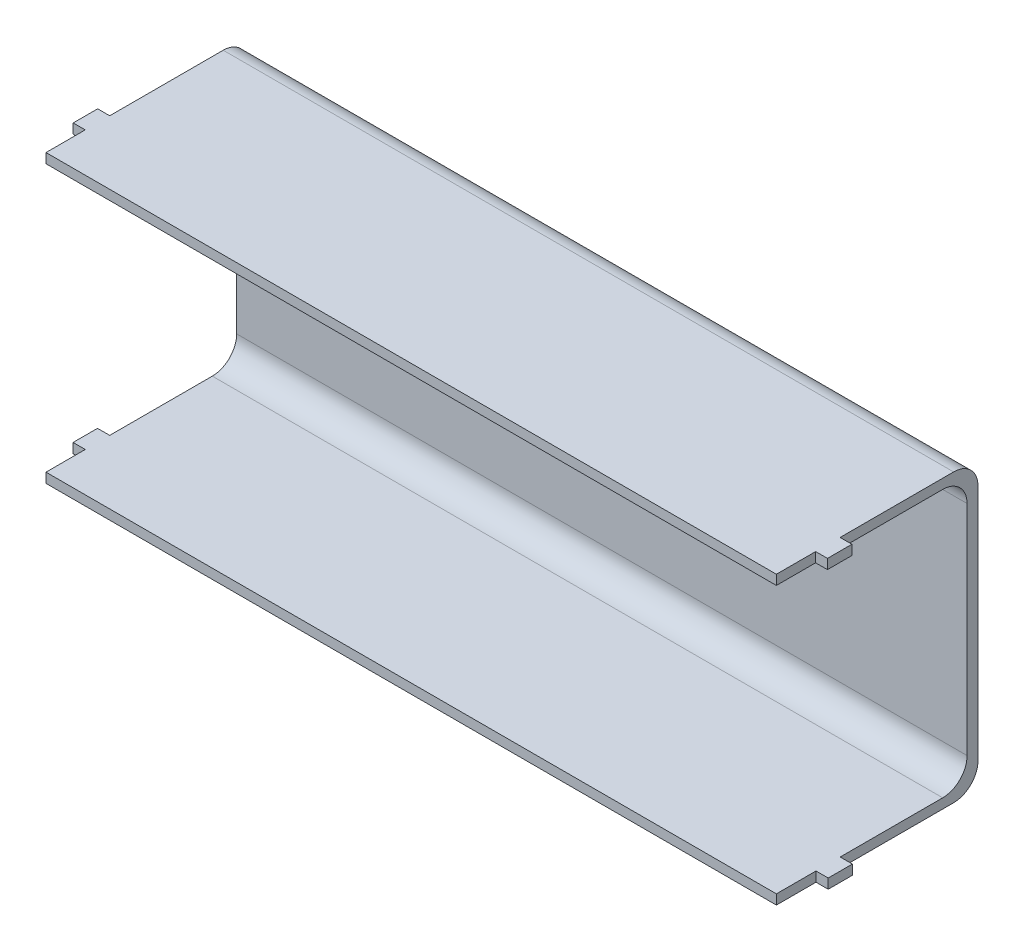
ISO-10303-21;
HEADER;
FILE_DESCRIPTION(('STEP AP214'),'2;1');
FILE_NAME('part.step','',(''),(''),'','','');
FILE_SCHEMA(('AUTOMOTIVE_DESIGN { 1 0 10303 214 1 1 1 1 }'));
ENDSEC;
DATA;
#1=APPLICATION_CONTEXT('core data for automotive mechanical design processes');
#2=APPLICATION_PROTOCOL_DEFINITION('international standard','automotive_design',2000,#1);
#3=PRODUCT_CONTEXT('',#1,'mechanical');
#4=PRODUCT('Part','Part','',(#3));
#5=PRODUCT_RELATED_PRODUCT_CATEGORY('part','',(#4));
#6=PRODUCT_DEFINITION_FORMATION('','',#4);
#7=PRODUCT_DEFINITION_CONTEXT('part definition',#1,'design');
#8=PRODUCT_DEFINITION('design','',#6,#7);
#9=PRODUCT_DEFINITION_SHAPE('','',#8);
#10=(LENGTH_UNIT() NAMED_UNIT(*) SI_UNIT(.MILLI.,.METRE.));
#11=(NAMED_UNIT(*) PLANE_ANGLE_UNIT() SI_UNIT($,.RADIAN.));
#12=(NAMED_UNIT(*) SI_UNIT($,.STERADIAN.) SOLID_ANGLE_UNIT());
#13=UNCERTAINTY_MEASURE_WITH_UNIT(LENGTH_MEASURE(1.E-05),#10,'distance_accuracy_value','');
#14=(GEOMETRIC_REPRESENTATION_CONTEXT(3) GLOBAL_UNCERTAINTY_ASSIGNED_CONTEXT((#13)) GLOBAL_UNIT_ASSIGNED_CONTEXT((#10,
#11,#12)) REPRESENTATION_CONTEXT('',''));
#15=CARTESIAN_POINT('',(0.,0.,0.));
#16=DIRECTION('',(0.,0.,1.));
#17=DIRECTION('',(1.,0.,0.));
#18=AXIS2_PLACEMENT_3D('',#15,#16,#17);
#19=CARTESIAN_POINT('',(-152.146,35.0366863405146,-34.6446155014796));
#20=DIRECTION('',(-1.,0.,0.));
#21=DIRECTION('',(0.,0.,1.));
#22=AXIS2_PLACEMENT_3D('',#19,#20,#21);
#23=PLANE('',#22);
#24=DIRECTION('',(0.,0.,-1.));
#25=VECTOR('',#24,1.);
#26=CARTESIAN_POINT('',(-152.146,-17.5478877019938,-36.917745162524));
#27=LINE('',#26,#25);
#28=CARTESIAN_POINT('',(-152.146,-17.5478877019938,-13.269153727947));
#29=VERTEX_POINT('',#28);
#30=CARTESIAN_POINT('',(-152.146,-17.5478877019938,-36.917745162524));
#31=VERTEX_POINT('',#30);
#32=EDGE_CURVE('E424',#29,#31,#27,.T.);
#33=ORIENTED_EDGE('',*,*,#32,.F.);
#34=DIRECTION('',(0.,-1.,0.));
#35=VECTOR('',#34,1.);
#36=CARTESIAN_POINT('',(-152.146,-15.5158877019938,-13.269153727947));
#37=LINE('',#36,#35);
#38=CARTESIAN_POINT('',(-152.146,-15.5158877019938,-13.269153727947));
#39=VERTEX_POINT('',#38);
#40=EDGE_CURVE('E264',#39,#29,#37,.T.);
#41=ORIENTED_EDGE('',*,*,#40,.F.);
#42=DIRECTION('',(0.,0.,1.));
#43=VECTOR('',#42,1.);
#44=CARTESIAN_POINT('',(-152.146,-15.5158877019938,-34.6446155014796));
#45=LINE('',#44,#43);
#46=CARTESIAN_POINT('',(-152.146,-15.5158877019938,-34.6446155014796));
#47=VERTEX_POINT('',#46);
#48=EDGE_CURVE('E416',#47,#39,#45,.T.);
#49=ORIENTED_EDGE('',*,*,#48,.F.);
#50=CARTESIAN_POINT('',(-152.146,-10.4358877019938,-34.6446155014796));
#51=DIRECTION('',(-1.,0.,0.));
#52=DIRECTION('',(0.,0.,1.));
#53=AXIS2_PLACEMENT_3D('',#50,#51,#52);
#54=CIRCLE('',#53,5.08);
#55=CARTESIAN_POINT('',(-152.146,-10.4358877019938,-39.7246155014796));
#56=VERTEX_POINT('',#55);
#57=EDGE_CURVE('E411',#56,#47,#54,.T.);
#58=ORIENTED_EDGE('',*,*,#57,.F.);
#59=DIRECTION('',(0.,-1.,0.));
#60=VECTOR('',#59,1.);
#61=CARTESIAN_POINT('',(-152.146,35.0366863405146,-39.7246155014796));
#62=LINE('',#61,#60);
#63=CARTESIAN_POINT('',(-152.146,35.0366863405146,-39.7246155014796));
#64=VERTEX_POINT('',#63);
#65=EDGE_CURVE('E407',#64,#56,#62,.T.);
#66=ORIENTED_EDGE('',*,*,#65,.F.);
#67=CARTESIAN_POINT('',(-152.146,35.0366863405146,-34.6446155014796));
#68=DIRECTION('',(-1.,0.,0.));
#69=DIRECTION('',(0.,0.,1.));
#70=AXIS2_PLACEMENT_3D('',#67,#68,#69);
#71=CIRCLE('',#70,5.08);
#72=CARTESIAN_POINT('',(-152.146,40.1166863405146,-34.6446155014796));
#73=VERTEX_POINT('',#72);
#74=EDGE_CURVE('E402',#73,#64,#71,.T.);
#75=ORIENTED_EDGE('',*,*,#74,.F.);
#76=DIRECTION('',(0.,0.,-1.));
#77=VECTOR('',#76,1.);
#78=CARTESIAN_POINT('',(-152.146,40.1166863405146,0.));
#79=LINE('',#78,#77);
#80=CARTESIAN_POINT('',(-152.146,40.1166863405146,-13.269153727947));
#81=VERTEX_POINT('',#80);
#82=EDGE_CURVE('E396',#81,#73,#79,.T.);
#83=ORIENTED_EDGE('',*,*,#82,.F.);
#84=DIRECTION('',(0.,1.,0.));
#85=VECTOR('',#84,1.);
#86=CARTESIAN_POINT('',(-152.146,40.1101122980062,-13.269153727947));
#87=LINE('',#86,#85);
#88=CARTESIAN_POINT('',(-152.146,42.1421122980062,-13.269153727947));
#89=VERTEX_POINT('',#88);
#90=EDGE_CURVE('E391',#81,#89,#87,.T.);
#91=ORIENTED_EDGE('',*,*,#90,.T.);
#92=DIRECTION('',(0.,0.,1.));
#93=VECTOR('',#92,1.);
#94=CARTESIAN_POINT('',(-152.146,42.1421122980062,0.));
#95=LINE('',#94,#93);
#96=CARTESIAN_POINT('',(-152.146,42.1421122980062,-36.917745162524));
#97=VERTEX_POINT('',#96);
#98=EDGE_CURVE('E441',#97,#89,#95,.T.);
#99=ORIENTED_EDGE('',*,*,#98,.F.);
#100=CARTESIAN_POINT('',(-152.146,37.0621122980062,-36.917745162524));
#101=DIRECTION('',(1.,0.,0.));
#102=DIRECTION('',(0.,0.,1.));
#103=AXIS2_PLACEMENT_3D('',#100,#101,#102);
#104=CIRCLE('',#103,5.08);
#105=CARTESIAN_POINT('',(-152.146,37.0621122980062,-41.997745162524));
#106=VERTEX_POINT('',#105);
#107=EDGE_CURVE('E436',#106,#97,#104,.T.);
#108=ORIENTED_EDGE('',*,*,#107,.F.);
#109=DIRECTION('',(0.,1.,0.));
#110=VECTOR('',#109,1.);
#111=CARTESIAN_POINT('',(-152.146,37.0621122980062,-41.997745162524));
#112=LINE('',#111,#110);
#113=CARTESIAN_POINT('',(-152.146,-12.4678877019938,-41.997745162524));
#114=VERTEX_POINT('',#113);
#115=EDGE_CURVE('E432',#114,#106,#112,.T.);
#116=ORIENTED_EDGE('',*,*,#115,.F.);
#117=CARTESIAN_POINT('',(-152.146,-12.4678877019938,-36.917745162524));
#118=DIRECTION('',(1.,0.,0.));
#119=DIRECTION('',(0.,0.,-1.));
#120=AXIS2_PLACEMENT_3D('',#117,#118,#119);
#121=CIRCLE('',#120,5.08);
#122=EDGE_CURVE('E428',#31,#114,#121,.T.);
#123=ORIENTED_EDGE('',*,*,#122,.F.);
#124=EDGE_LOOP('',(#33,#41,#49,#58,#66,#75,#83,#91,#99,#108,#116,#123));
#125=FACE_BOUND('',#124,.T.);
#126=ADVANCED_FACE('F39',(#125),#23,.T.);
#127=CARTESIAN_POINT('',(-152.146,-15.5158877019938,-8.17718568589497));
#128=VERTEX_POINT('',#127);
#129=CARTESIAN_POINT('',(-152.146,-15.5158877019938,0.));
#130=VERTEX_POINT('',#129);
#131=EDGE_CURVE('E415',#128,#130,#45,.T.);
#132=ORIENTED_EDGE('',*,*,#131,.F.);
#133=DIRECTION('',(0.,1.,0.));
#134=VECTOR('',#133,1.);
#135=CARTESIAN_POINT('',(-152.146,-15.5158877019938,-8.17718568589497));
#136=LINE('',#135,#134);
#137=CARTESIAN_POINT('',(-152.146,-17.5478877019938,-8.17718568589497));
#138=VERTEX_POINT('',#137);
#139=EDGE_CURVE('E260',#138,#128,#136,.T.);
#140=ORIENTED_EDGE('',*,*,#139,.F.);
#141=CARTESIAN_POINT('',(-152.146,-17.5478877019938,0.));
#142=VERTEX_POINT('',#141);
#143=EDGE_CURVE('E425',#142,#138,#27,.T.);
#144=ORIENTED_EDGE('',*,*,#143,.F.);
#145=DIRECTION('',(0.,-1.,0.));
#146=VECTOR('',#145,1.);
#147=CARTESIAN_POINT('',(-152.146,-15.5158877019938,0.));
#148=LINE('',#147,#146);
#149=EDGE_CURVE('E420',#130,#142,#148,.T.);
#150=ORIENTED_EDGE('',*,*,#149,.F.);
#151=EDGE_LOOP('',(#132,#140,#144,#150));
#152=FACE_BOUND('',#151,.T.);
#153=ADVANCED_FACE('F618',(#152),#23,.T.);
#154=CARTESIAN_POINT('',(0.,35.0366863405146,-34.6446155014796));
#155=DIRECTION('',(-1.,0.,0.));
#156=DIRECTION('',(0.,0.,1.));
#157=AXIS2_PLACEMENT_3D('',#154,#155,#156);
#158=PLANE('',#157);
#159=DIRECTION('',(0.,-1.,0.));
#160=VECTOR('',#159,1.);
#161=CARTESIAN_POINT('',(0.,-15.5158877019938,-8.25274863230552));
#162=LINE('',#161,#160);
#163=CARTESIAN_POINT('',(0.,-15.5158877019938,-8.25274863230552));
#164=VERTEX_POINT('',#163);
#165=CARTESIAN_POINT('',(0.,-17.5478877019938,-8.25274863230552));
#166=VERTEX_POINT('',#165);
#167=EDGE_CURVE('E267',#164,#166,#162,.T.);
#168=ORIENTED_EDGE('',*,*,#167,.F.);
#169=DIRECTION('',(0.,0.,1.));
#170=VECTOR('',#169,1.);
#171=CARTESIAN_POINT('',(0.,-15.5158877019938,-34.6446155014796));
#172=LINE('',#171,#170);
#173=CARTESIAN_POINT('',(0.,-15.5158877019938,0.));
#174=VERTEX_POINT('',#173);
#175=EDGE_CURVE('E466',#164,#174,#172,.T.);
#176=ORIENTED_EDGE('',*,*,#175,.T.);
#177=DIRECTION('',(0.,-1.,0.));
#178=VECTOR('',#177,1.);
#179=CARTESIAN_POINT('',(0.,-15.5158877019938,0.));
#180=LINE('',#179,#178);
#181=CARTESIAN_POINT('',(0.,-17.5478877019938,0.));
#182=VERTEX_POINT('',#181);
#183=EDGE_CURVE('E470',#174,#182,#180,.T.);
#184=ORIENTED_EDGE('',*,*,#183,.T.);
#185=DIRECTION('',(0.,0.,-1.));
#186=VECTOR('',#185,1.);
#187=CARTESIAN_POINT('',(0.,-17.5478877019938,-36.917745162524));
#188=LINE('',#187,#186);
#189=EDGE_CURVE('E475',#182,#166,#188,.T.);
#190=ORIENTED_EDGE('',*,*,#189,.T.);
#191=EDGE_LOOP('',(#168,#176,#184,#190));
#192=FACE_BOUND('',#191,.T.);
#193=ADVANCED_FACE('F622',(#192),#158,.F.);
#194=DIRECTION('',(0.,1.,0.));
#195=VECTOR('',#194,1.);
#196=CARTESIAN_POINT('',(0.,-15.5158877019938,-13.2907422880195));
#197=LINE('',#196,#195);
#198=CARTESIAN_POINT('',(0.,-17.5478877019938,-13.2907422880195));
#199=VERTEX_POINT('',#198);
#200=CARTESIAN_POINT('',(0.,-15.5158877019938,-13.2907422880195));
#201=VERTEX_POINT('',#200);
#202=EDGE_CURVE('E66',#199,#201,#197,.T.);
#203=ORIENTED_EDGE('',*,*,#202,.F.);
#204=CARTESIAN_POINT('',(0.,-17.5478877019938,-36.917745162524));
#205=VERTEX_POINT('',#204);
#206=EDGE_CURVE('E474',#199,#205,#188,.T.);
#207=ORIENTED_EDGE('',*,*,#206,.T.);
#208=CARTESIAN_POINT('',(0.,-12.4678877019938,-36.917745162524));
#209=DIRECTION('',(1.,0.,0.));
#210=DIRECTION('',(0.,0.,-1.));
#211=AXIS2_PLACEMENT_3D('',#208,#209,#210);
#212=CIRCLE('',#211,5.08);
#213=CARTESIAN_POINT('',(0.,-12.4678877019938,-41.997745162524));
#214=VERTEX_POINT('',#213);
#215=EDGE_CURVE('E478',#205,#214,#212,.T.);
#216=ORIENTED_EDGE('',*,*,#215,.T.);
#217=DIRECTION('',(0.,1.,0.));
#218=VECTOR('',#217,1.);
#219=CARTESIAN_POINT('',(0.,37.0621122980062,-41.997745162524));
#220=LINE('',#219,#218);
#221=CARTESIAN_POINT('',(0.,37.0621122980062,-41.997745162524));
#222=VERTEX_POINT('',#221);
#223=EDGE_CURVE('E482',#214,#222,#220,.T.);
#224=ORIENTED_EDGE('',*,*,#223,.T.);
#225=CARTESIAN_POINT('',(0.,37.0621122980062,-36.917745162524));
#226=DIRECTION('',(1.,0.,0.));
#227=DIRECTION('',(0.,0.,1.));
#228=AXIS2_PLACEMENT_3D('',#225,#226,#227);
#229=CIRCLE('',#228,5.08);
#230=CARTESIAN_POINT('',(0.,42.1421122980062,-36.917745162524));
#231=VERTEX_POINT('',#230);
#232=EDGE_CURVE('E486',#222,#231,#229,.T.);
#233=ORIENTED_EDGE('',*,*,#232,.T.);
#234=DIRECTION('',(0.,0.,1.));
#235=VECTOR('',#234,1.);
#236=CARTESIAN_POINT('',(0.,42.1421122980062,0.));
#237=LINE('',#236,#235);
#238=CARTESIAN_POINT('',(0.,42.1421122980062,-13.269153727947));
#239=VERTEX_POINT('',#238);
#240=EDGE_CURVE('E397',#231,#239,#237,.T.);
#241=ORIENTED_EDGE('',*,*,#240,.T.);
#242=DIRECTION('',(0.,1.,0.));
#243=VECTOR('',#242,1.);
#244=CARTESIAN_POINT('',(0.,40.1101122980062,-13.269153727947));
#245=LINE('',#244,#243);
#246=CARTESIAN_POINT('',(0.,40.1166863405146,-13.269153727947));
#247=VERTEX_POINT('',#246);
#248=EDGE_CURVE('E11',#247,#239,#245,.T.);
#249=ORIENTED_EDGE('',*,*,#248,.F.);
#250=DIRECTION('',(0.,0.,-1.));
#251=VECTOR('',#250,1.);
#252=CARTESIAN_POINT('',(0.,40.1166863405146,0.));
#253=LINE('',#252,#251);
#254=CARTESIAN_POINT('',(0.,40.1166863405146,-34.6446155014796));
#255=VERTEX_POINT('',#254);
#256=EDGE_CURVE('E448',#247,#255,#253,.T.);
#257=ORIENTED_EDGE('',*,*,#256,.T.);
#258=CARTESIAN_POINT('',(0.,35.0366863405146,-34.6446155014796));
#259=DIRECTION('',(-1.,0.,0.));
#260=DIRECTION('',(0.,0.,1.));
#261=AXIS2_PLACEMENT_3D('',#258,#259,#260);
#262=CIRCLE('',#261,5.08);
#263=CARTESIAN_POINT('',(0.,35.0366863405146,-39.7246155014796));
#264=VERTEX_POINT('',#263);
#265=EDGE_CURVE('E453',#255,#264,#262,.T.);
#266=ORIENTED_EDGE('',*,*,#265,.T.);
#267=DIRECTION('',(0.,-1.,0.));
#268=VECTOR('',#267,1.);
#269=CARTESIAN_POINT('',(0.,35.0366863405146,-39.7246155014796));
#270=LINE('',#269,#268);
#271=CARTESIAN_POINT('',(0.,-10.4358877019938,-39.7246155014796));
#272=VERTEX_POINT('',#271);
#273=EDGE_CURVE('E458',#264,#272,#270,.T.);
#274=ORIENTED_EDGE('',*,*,#273,.T.);
#275=CARTESIAN_POINT('',(0.,-10.4358877019938,-34.6446155014796));
#276=DIRECTION('',(-1.,0.,0.));
#277=DIRECTION('',(0.,0.,1.));
#278=AXIS2_PLACEMENT_3D('',#275,#276,#277);
#279=CIRCLE('',#278,5.08);
#280=CARTESIAN_POINT('',(0.,-15.5158877019938,-34.6446155014796));
#281=VERTEX_POINT('',#280);
#282=EDGE_CURVE('E462',#272,#281,#279,.T.);
#283=ORIENTED_EDGE('',*,*,#282,.T.);
#284=EDGE_CURVE('E467',#281,#201,#172,.T.);
#285=ORIENTED_EDGE('',*,*,#284,.T.);
#286=EDGE_LOOP('',(#203,#207,#216,#224,#233,#241,#249,#257,#266,#274,#283,#285));
#287=FACE_BOUND('',#286,.T.);
#288=ADVANCED_FACE('F564',(#287),#158,.F.);
#289=CARTESIAN_POINT('',(-152.146,42.1421122980062,0.));
#290=DIRECTION('',(0.,0.,1.));
#291=DIRECTION('',(1.,0.,0.));
#292=AXIS2_PLACEMENT_3D('',#289,#290,#291);
#293=PLANE('',#292);
#294=DIRECTION('',(0.,-1.,0.));
#295=VECTOR('',#294,1.);
#296=CARTESIAN_POINT('',(0.,42.1421122980062,0.));
#297=LINE('',#296,#295);
#298=CARTESIAN_POINT('',(0.,42.1421122980062,0.));
#299=VERTEX_POINT('',#298);
#300=CARTESIAN_POINT('',(0.,40.1166863405146,0.));
#301=VERTEX_POINT('',#300);
#302=EDGE_CURVE('E380',#299,#301,#297,.T.);
#303=ORIENTED_EDGE('',*,*,#302,.F.);
#304=DIRECTION('',(1.,0.,0.));
#305=VECTOR('',#304,1.);
#306=CARTESIAN_POINT('',(-152.146,42.1421122980062,0.));
#307=LINE('',#306,#305);
#308=CARTESIAN_POINT('',(-152.146,42.1421122980062,0.));
#309=VERTEX_POINT('',#308);
#310=EDGE_CURVE('E494',#309,#299,#307,.T.);
#311=ORIENTED_EDGE('',*,*,#310,.F.);
#312=DIRECTION('',(0.,-1.,0.));
#313=VECTOR('',#312,1.);
#314=CARTESIAN_POINT('',(-152.146,42.1421122980062,0.));
#315=LINE('',#314,#313);
#316=CARTESIAN_POINT('',(-152.146,40.1166863405146,0.));
#317=VERTEX_POINT('',#316);
#318=EDGE_CURVE('E392',#309,#317,#315,.T.);
#319=ORIENTED_EDGE('',*,*,#318,.T.);
#320=DIRECTION('',(1.,0.,0.));
#321=VECTOR('',#320,1.);
#322=CARTESIAN_POINT('',(-152.146,40.1166863405146,0.));
#323=LINE('',#322,#321);
#324=EDGE_CURVE('E43',#317,#301,#323,.T.);
#325=ORIENTED_EDGE('',*,*,#324,.T.);
#326=EDGE_LOOP('',(#303,#311,#319,#325));
#327=FACE_BOUND('',#326,.T.);
#328=ADVANCED_FACE('F41',(#327),#293,.T.);
#329=CARTESIAN_POINT('',(-152.146,42.1421122980062,0.));
#330=DIRECTION('',(0.,1.,0.));
#331=DIRECTION('',(0.,0.,1.));
#332=AXIS2_PLACEMENT_3D('',#329,#330,#331);
#333=PLANE('',#332);
#334=ORIENTED_EDGE('',*,*,#240,.F.);
#335=DIRECTION('',(1.,0.,0.));
#336=VECTOR('',#335,1.);
#337=CARTESIAN_POINT('',(-152.146,42.1421122980062,-36.917745162524));
#338=LINE('',#337,#336);
#339=EDGE_CURVE('E498',#97,#231,#338,.T.);
#340=ORIENTED_EDGE('',*,*,#339,.F.);
#341=ORIENTED_EDGE('',*,*,#98,.T.);
#342=DIRECTION('',(-1.,0.,0.));
#343=VECTOR('',#342,1.);
#344=CARTESIAN_POINT('',(-152.146,42.1421122980062,-13.269153727947));
#345=LINE('',#344,#343);
#346=CARTESIAN_POINT('',(-154.65553625409,42.1421122980062,-13.269153727947));
#347=VERTEX_POINT('',#346);
#348=EDGE_CURVE('E338',#89,#347,#345,.T.);
#349=ORIENTED_EDGE('',*,*,#348,.T.);
#350=DIRECTION('',(0.,0.,1.));
#351=VECTOR('',#350,1.);
#352=CARTESIAN_POINT('',(-154.65553625409,42.1421122980062,-13.269153727947));
#353=LINE('',#352,#351);
#354=CARTESIAN_POINT('',(-154.65553625409,42.1421122980062,-8.17718568589497));
#355=VERTEX_POINT('',#354);
#356=EDGE_CURVE('E369',#347,#355,#353,.T.);
#357=ORIENTED_EDGE('',*,*,#356,.T.);
#358=DIRECTION('',(1.,0.,0.));
#359=VECTOR('',#358,1.);
#360=CARTESIAN_POINT('',(-154.65553625409,42.1421122980062,-8.17718568589497));
#361=LINE('',#360,#359);
#362=CARTESIAN_POINT('',(-152.146,42.1421122980062,-8.17718568589498));
#363=VERTEX_POINT('',#362);
#364=EDGE_CURVE('E353',#355,#363,#361,.T.);
#365=ORIENTED_EDGE('',*,*,#364,.T.);
#366=EDGE_CURVE('E440',#363,#309,#95,.T.);
#367=ORIENTED_EDGE('',*,*,#366,.T.);
#368=ORIENTED_EDGE('',*,*,#310,.T.);
#369=CARTESIAN_POINT('',(0.,42.1421122980062,-8.17718568589498));
#370=VERTEX_POINT('',#369);
#371=EDGE_CURVE('E490',#370,#299,#237,.T.);
#372=ORIENTED_EDGE('',*,*,#371,.F.);
#373=DIRECTION('',(1.,0.,0.));
#374=VECTOR('',#373,1.);
#375=CARTESIAN_POINT('',(2.45739993800953,42.1421122980062,-8.17718568589498));
#376=LINE('',#375,#374);
#377=CARTESIAN_POINT('',(2.45739993800953,42.1421122980062,-8.17718568589498));
#378=VERTEX_POINT('',#377);
#379=EDGE_CURVE('E307',#370,#378,#376,.T.);
#380=ORIENTED_EDGE('',*,*,#379,.T.);
#381=DIRECTION('',(0.,0.,-1.));
#382=VECTOR('',#381,1.);
#383=CARTESIAN_POINT('',(2.45739993800953,42.1421122980062,-13.269153727947));
#384=LINE('',#383,#382);
#385=CARTESIAN_POINT('',(2.45739993800953,42.1421122980062,-13.269153727947));
#386=VERTEX_POINT('',#385);
#387=EDGE_CURVE('E329',#378,#386,#384,.T.);
#388=ORIENTED_EDGE('',*,*,#387,.T.);
#389=DIRECTION('',(-1.,0.,0.));
#390=VECTOR('',#389,1.);
#391=CARTESIAN_POINT('',(0.,42.1421122980062,-13.269153727947));
#392=LINE('',#391,#390);
#393=EDGE_CURVE('E313',#386,#239,#392,.T.);
#394=ORIENTED_EDGE('',*,*,#393,.T.);
#395=EDGE_LOOP('',(#334,#340,#341,#349,#357,#365,#367,#368,#372,#380,#388,#394));
#396=FACE_BOUND('',#395,.T.);
#397=ADVANCED_FACE('F549',(#396),#333,.T.);
#398=CARTESIAN_POINT('',(-152.146,37.0621122980062,-36.917745162524));
#399=DIRECTION('',(1.,0.,0.));
#400=DIRECTION('',(0.,0.,-1.));
#401=AXIS2_PLACEMENT_3D('',#398,#399,#400);
#402=CYLINDRICAL_SURFACE('',#401,5.08);
#403=ORIENTED_EDGE('',*,*,#232,.F.);
#404=DIRECTION('',(1.,0.,0.));
#405=VECTOR('',#404,1.);
#406=CARTESIAN_POINT('',(-152.146,37.0621122980062,-41.997745162524));
#407=LINE('',#406,#405);
#408=EDGE_CURVE('E501',#106,#222,#407,.T.);
#409=ORIENTED_EDGE('',*,*,#408,.F.);
#410=ORIENTED_EDGE('',*,*,#107,.T.);
#411=ORIENTED_EDGE('',*,*,#339,.T.);
#412=EDGE_LOOP('',(#403,#409,#410,#411));
#413=FACE_BOUND('',#412,.T.);
#414=ADVANCED_FACE('F594',(#413),#402,.T.);
#415=CARTESIAN_POINT('',(-152.146,37.0621122980062,-41.997745162524));
#416=DIRECTION('',(0.,0.,-1.));
#417=DIRECTION('',(0.,1.,0.));
#418=AXIS2_PLACEMENT_3D('',#415,#416,#417);
#419=PLANE('',#418);
#420=ORIENTED_EDGE('',*,*,#223,.F.);
#421=DIRECTION('',(1.,0.,0.));
#422=VECTOR('',#421,1.);
#423=CARTESIAN_POINT('',(-152.146,-12.4678877019938,-41.997745162524));
#424=LINE('',#423,#422);
#425=EDGE_CURVE('E504',#114,#214,#424,.T.);
#426=ORIENTED_EDGE('',*,*,#425,.F.);
#427=ORIENTED_EDGE('',*,*,#115,.T.);
#428=ORIENTED_EDGE('',*,*,#408,.T.);
#429=EDGE_LOOP('',(#420,#426,#427,#428));
#430=FACE_BOUND('',#429,.T.);
#431=ADVANCED_FACE('F599',(#430),#419,.T.);
#432=CARTESIAN_POINT('',(-152.146,-12.4678877019938,-36.917745162524));
#433=DIRECTION('',(1.,0.,0.));
#434=DIRECTION('',(0.,0.,-1.));
#435=AXIS2_PLACEMENT_3D('',#432,#433,#434);
#436=CYLINDRICAL_SURFACE('',#435,5.08);
#437=ORIENTED_EDGE('',*,*,#215,.F.);
#438=DIRECTION('',(1.,0.,0.));
#439=VECTOR('',#438,1.);
#440=CARTESIAN_POINT('',(-152.146,-17.5478877019938,-36.917745162524));
#441=LINE('',#440,#439);
#442=EDGE_CURVE('E507',#31,#205,#441,.T.);
#443=ORIENTED_EDGE('',*,*,#442,.F.);
#444=ORIENTED_EDGE('',*,*,#122,.T.);
#445=ORIENTED_EDGE('',*,*,#425,.T.);
#446=EDGE_LOOP('',(#437,#443,#444,#445));
#447=FACE_BOUND('',#446,.T.);
#448=ADVANCED_FACE('F602',(#447),#436,.T.);
#449=CARTESIAN_POINT('',(-152.146,-17.5478877019938,-36.917745162524));
#450=DIRECTION('',(0.,-1.,0.));
#451=DIRECTION('',(0.,0.,-1.));
#452=AXIS2_PLACEMENT_3D('',#449,#450,#451);
#453=PLANE('',#452);
#454=ORIENTED_EDGE('',*,*,#189,.F.);
#455=DIRECTION('',(1.,0.,0.));
#456=VECTOR('',#455,1.);
#457=CARTESIAN_POINT('',(-152.146,-17.5478877019938,0.));
#458=LINE('',#457,#456);
#459=EDGE_CURVE('E511',#142,#182,#458,.T.);
#460=ORIENTED_EDGE('',*,*,#459,.F.);
#461=ORIENTED_EDGE('',*,*,#143,.T.);
#462=DIRECTION('',(1.,0.,0.));
#463=VECTOR('',#462,1.);
#464=CARTESIAN_POINT('',(-154.686,-17.5478877019938,-8.17718568589497));
#465=LINE('',#464,#463);
#466=CARTESIAN_POINT('',(-154.686,-17.5478877019938,-8.17718568589497));
#467=VERTEX_POINT('',#466);
#468=EDGE_CURVE('E247',#467,#138,#465,.T.);
#469=ORIENTED_EDGE('',*,*,#468,.F.);
#470=DIRECTION('',(0.,0.,1.));
#471=VECTOR('',#470,1.);
#472=CARTESIAN_POINT('',(-154.686,-17.5478877019938,-13.269153727947));
#473=LINE('',#472,#471);
#474=CARTESIAN_POINT('',(-154.686,-17.5478877019938,-13.269153727947));
#475=VERTEX_POINT('',#474);
#476=EDGE_CURVE('E239',#475,#467,#473,.T.);
#477=ORIENTED_EDGE('',*,*,#476,.F.);
#478=DIRECTION('',(1.,0.,0.));
#479=VECTOR('',#478,1.);
#480=CARTESIAN_POINT('',(-154.686,-17.5478877019938,-13.269153727947));
#481=LINE('',#480,#479);
#482=EDGE_CURVE('E244',#475,#29,#481,.T.);
#483=ORIENTED_EDGE('',*,*,#482,.T.);
#484=ORIENTED_EDGE('',*,*,#32,.T.);
#485=ORIENTED_EDGE('',*,*,#442,.T.);
#486=ORIENTED_EDGE('',*,*,#206,.F.);
#487=DIRECTION('',(-1.,0.,0.));
#488=VECTOR('',#487,1.);
#489=CARTESIAN_POINT('',(2.54,-17.5478877019938,-13.2907422880195));
#490=LINE('',#489,#488);
#491=CARTESIAN_POINT('',(2.54,-17.5478877019938,-13.2907422880195));
#492=VERTEX_POINT('',#491);
#493=EDGE_CURVE('E299',#492,#199,#490,.T.);
#494=ORIENTED_EDGE('',*,*,#493,.F.);
#495=DIRECTION('',(0.,0.,-1.));
#496=VECTOR('',#495,1.);
#497=CARTESIAN_POINT('',(2.54,-17.5478877019938,-8.25274863230552));
#498=LINE('',#497,#496);
#499=CARTESIAN_POINT('',(2.54,-17.5478877019938,-8.25274863230552));
#500=VERTEX_POINT('',#499);
#501=EDGE_CURVE('E280',#500,#492,#498,.T.);
#502=ORIENTED_EDGE('',*,*,#501,.F.);
#503=DIRECTION('',(-1.,0.,0.));
#504=VECTOR('',#503,1.);
#505=CARTESIAN_POINT('',(2.54,-17.5478877019938,-8.25274863230552));
#506=LINE('',#505,#504);
#507=EDGE_CURVE('E303',#500,#166,#506,.T.);
#508=ORIENTED_EDGE('',*,*,#507,.T.);
#509=EDGE_LOOP('',(#454,#460,#461,#469,#477,#483,#484,#485,#486,#494,#502,#508));
#510=FACE_BOUND('',#509,.T.);
#511=ADVANCED_FACE('F242',(#510),#453,.T.);
#512=CARTESIAN_POINT('',(-152.146,-15.5158877019938,0.));
#513=DIRECTION('',(0.,0.,1.));
#514=DIRECTION('',(1.,0.,0.));
#515=AXIS2_PLACEMENT_3D('',#512,#513,#514);
#516=PLANE('',#515);
#517=ORIENTED_EDGE('',*,*,#183,.F.);
#518=DIRECTION('',(1.,0.,0.));
#519=VECTOR('',#518,1.);
#520=CARTESIAN_POINT('',(-152.146,-15.5158877019938,0.));
#521=LINE('',#520,#519);
#522=EDGE_CURVE('E514',#130,#174,#521,.T.);
#523=ORIENTED_EDGE('',*,*,#522,.F.);
#524=ORIENTED_EDGE('',*,*,#149,.T.);
#525=ORIENTED_EDGE('',*,*,#459,.T.);
#526=EDGE_LOOP('',(#517,#523,#524,#525));
#527=FACE_BOUND('',#526,.T.);
#528=ADVANCED_FACE('F616',(#527),#516,.T.);
#529=CARTESIAN_POINT('',(-152.146,-15.5158877019938,-34.6446155014796));
#530=DIRECTION('',(0.,1.,0.));
#531=DIRECTION('',(0.,0.,1.));
#532=AXIS2_PLACEMENT_3D('',#529,#530,#531);
#533=PLANE('',#532);
#534=ORIENTED_EDGE('',*,*,#284,.F.);
#535=DIRECTION('',(1.,0.,0.));
#536=VECTOR('',#535,1.);
#537=CARTESIAN_POINT('',(-152.146,-15.5158877019938,-34.6446155014796));
#538=LINE('',#537,#536);
#539=EDGE_CURVE('E518',#47,#281,#538,.T.);
#540=ORIENTED_EDGE('',*,*,#539,.F.);
#541=ORIENTED_EDGE('',*,*,#48,.T.);
#542=DIRECTION('',(1.,0.,0.));
#543=VECTOR('',#542,1.);
#544=CARTESIAN_POINT('',(-154.686,-15.5158877019938,-13.269153727947));
#545=LINE('',#544,#543);
#546=CARTESIAN_POINT('',(-154.686,-15.5158877019938,-13.269153727947));
#547=VERTEX_POINT('',#546);
#548=EDGE_CURVE('E900',#547,#39,#545,.T.);
#549=ORIENTED_EDGE('',*,*,#548,.F.);
#550=DIRECTION('',(0.,0.,-1.));
#551=VECTOR('',#550,1.);
#552=CARTESIAN_POINT('',(-154.686,-15.5158877019938,-13.269153727947));
#553=LINE('',#552,#551);
#554=CARTESIAN_POINT('',(-154.686,-15.5158877019938,-8.17718568589497));
#555=VERTEX_POINT('',#554);
#556=EDGE_CURVE('E256',#555,#547,#553,.T.);
#557=ORIENTED_EDGE('',*,*,#556,.F.);
#558=DIRECTION('',(1.,0.,0.));
#559=VECTOR('',#558,1.);
#560=CARTESIAN_POINT('',(-154.686,-15.5158877019938,-8.17718568589497));
#561=LINE('',#560,#559);
#562=EDGE_CURVE('E58',#555,#128,#561,.T.);
#563=ORIENTED_EDGE('',*,*,#562,.T.);
#564=ORIENTED_EDGE('',*,*,#131,.T.);
#565=ORIENTED_EDGE('',*,*,#522,.T.);
#566=ORIENTED_EDGE('',*,*,#175,.F.);
#567=DIRECTION('',(-1.,0.,0.));
#568=VECTOR('',#567,1.);
#569=CARTESIAN_POINT('',(2.54,-15.5158877019938,-8.25274863230552));
#570=LINE('',#569,#568);
#571=CARTESIAN_POINT('',(2.54,-15.5158877019938,-8.25274863230552));
#572=VERTEX_POINT('',#571);
#573=EDGE_CURVE('E288',#572,#164,#570,.T.);
#574=ORIENTED_EDGE('',*,*,#573,.F.);
#575=DIRECTION('',(0.,0.,1.));
#576=VECTOR('',#575,1.);
#577=CARTESIAN_POINT('',(2.54,-15.5158877019938,-8.25274863230552));
#578=LINE('',#577,#576);
#579=CARTESIAN_POINT('',(2.54,-15.5158877019938,-13.2907422880195));
#580=VERTEX_POINT('',#579);
#581=EDGE_CURVE('E286',#580,#572,#578,.T.);
#582=ORIENTED_EDGE('',*,*,#581,.F.);
#583=DIRECTION('',(-1.,0.,0.));
#584=VECTOR('',#583,1.);
#585=CARTESIAN_POINT('',(2.54,-15.5158877019938,-13.2907422880195));
#586=LINE('',#585,#584);
#587=EDGE_CURVE('E295',#580,#201,#586,.T.);
#588=ORIENTED_EDGE('',*,*,#587,.T.);
#589=EDGE_LOOP('',(#534,#540,#541,#549,#557,#563,#564,#565,#566,#574,#582,#588));
#590=FACE_BOUND('',#589,.T.);
#591=ADVANCED_FACE('F610',(#590),#533,.T.);
#592=CARTESIAN_POINT('',(-152.146,-10.4358877019938,-34.6446155014796));
#593=DIRECTION('',(1.,0.,0.));
#594=DIRECTION('',(0.,0.,-1.));
#595=AXIS2_PLACEMENT_3D('',#592,#593,#594);
#596=CYLINDRICAL_SURFACE('',#595,5.08);
#597=ORIENTED_EDGE('',*,*,#282,.F.);
#598=DIRECTION('',(1.,0.,0.));
#599=VECTOR('',#598,1.);
#600=CARTESIAN_POINT('',(-152.146,-10.4358877019938,-39.7246155014796));
#601=LINE('',#600,#599);
#602=EDGE_CURVE('E521',#56,#272,#601,.T.);
#603=ORIENTED_EDGE('',*,*,#602,.F.);
#604=ORIENTED_EDGE('',*,*,#57,.T.);
#605=ORIENTED_EDGE('',*,*,#539,.T.);
#606=EDGE_LOOP('',(#597,#603,#604,#605));
#607=FACE_BOUND('',#606,.T.);
#608=ADVANCED_FACE('F638',(#607),#596,.F.);
#609=CARTESIAN_POINT('',(-152.146,35.0366863405146,-39.7246155014796));
#610=DIRECTION('',(0.,0.,1.));
#611=DIRECTION('',(0.,-1.,0.));
#612=AXIS2_PLACEMENT_3D('',#609,#610,#611);
#613=PLANE('',#612);
#614=ORIENTED_EDGE('',*,*,#273,.F.);
#615=DIRECTION('',(1.,0.,0.));
#616=VECTOR('',#615,1.);
#617=CARTESIAN_POINT('',(-152.146,35.0366863405146,-39.7246155014796));
#618=LINE('',#617,#616);
#619=EDGE_CURVE('E524',#64,#264,#618,.T.);
#620=ORIENTED_EDGE('',*,*,#619,.F.);
#621=ORIENTED_EDGE('',*,*,#65,.T.);
#622=ORIENTED_EDGE('',*,*,#602,.T.);
#623=EDGE_LOOP('',(#614,#620,#621,#622));
#624=FACE_BOUND('',#623,.T.);
#625=ADVANCED_FACE('F642',(#624),#613,.T.);
#626=CARTESIAN_POINT('',(-152.146,35.0366863405146,-34.6446155014796));
#627=DIRECTION('',(1.,0.,0.));
#628=DIRECTION('',(0.,0.,-1.));
#629=AXIS2_PLACEMENT_3D('',#626,#627,#628);
#630=CYLINDRICAL_SURFACE('',#629,5.08);
#631=ORIENTED_EDGE('',*,*,#265,.F.);
#632=DIRECTION('',(1.,0.,0.));
#633=VECTOR('',#632,1.);
#634=CARTESIAN_POINT('',(-152.146,40.1166863405146,-34.6446155014796));
#635=LINE('',#634,#633);
#636=EDGE_CURVE('E526',#73,#255,#635,.T.);
#637=ORIENTED_EDGE('',*,*,#636,.F.);
#638=ORIENTED_EDGE('',*,*,#74,.T.);
#639=ORIENTED_EDGE('',*,*,#619,.T.);
#640=EDGE_LOOP('',(#631,#637,#638,#639));
#641=FACE_BOUND('',#640,.T.);
#642=ADVANCED_FACE('F644',(#641),#630,.F.);
#643=CARTESIAN_POINT('',(-152.146,40.1166863405146,0.));
#644=DIRECTION('',(0.,-1.,0.));
#645=DIRECTION('',(0.,0.,-1.));
#646=AXIS2_PLACEMENT_3D('',#643,#644,#645);
#647=PLANE('',#646);
#648=CARTESIAN_POINT('',(0.,40.1166863405146,-8.17718568589498));
#649=VERTEX_POINT('',#648);
#650=EDGE_CURVE('E449',#301,#649,#253,.T.);
#651=ORIENTED_EDGE('',*,*,#650,.F.);
#652=ORIENTED_EDGE('',*,*,#324,.F.);
#653=CARTESIAN_POINT('',(-152.146,40.1166863405146,-8.17718568589498));
#654=VERTEX_POINT('',#653);
#655=EDGE_CURVE('E398',#317,#654,#79,.T.);
#656=ORIENTED_EDGE('',*,*,#655,.T.);
#657=EDGE_CURVE('E403',#654,#81,#79,.T.);
#658=ORIENTED_EDGE('',*,*,#657,.T.);
#659=ORIENTED_EDGE('',*,*,#82,.T.);
#660=ORIENTED_EDGE('',*,*,#636,.T.);
#661=ORIENTED_EDGE('',*,*,#256,.F.);
#662=EDGE_CURVE('E454',#649,#247,#253,.T.);
#663=ORIENTED_EDGE('',*,*,#662,.F.);
#664=EDGE_LOOP('',(#651,#652,#656,#658,#659,#660,#661,#663));
#665=FACE_BOUND('',#664,.T.);
#666=ADVANCED_FACE('F541',(#665),#647,.T.);
#667=DIRECTION('',(0.,1.,0.));
#668=VECTOR('',#667,1.);
#669=CARTESIAN_POINT('',(-152.146,40.1101122980062,-8.17718568589498));
#670=LINE('',#669,#668);
#671=EDGE_CURVE('E382',#654,#363,#670,.T.);
#672=ORIENTED_EDGE('',*,*,#671,.F.);
#673=ORIENTED_EDGE('',*,*,#655,.F.);
#674=ORIENTED_EDGE('',*,*,#318,.F.);
#675=ORIENTED_EDGE('',*,*,#366,.F.);
#676=EDGE_LOOP('',(#672,#673,#674,#675));
#677=FACE_BOUND('',#676,.T.);
#678=ADVANCED_FACE('F553',(#677),#23,.T.);
#679=ORIENTED_EDGE('',*,*,#650,.T.);
#680=DIRECTION('',(0.,1.,0.));
#681=VECTOR('',#680,1.);
#682=CARTESIAN_POINT('',(0.,40.1101122980062,-8.17718568589498));
#683=LINE('',#682,#681);
#684=EDGE_CURVE('E49',#649,#370,#683,.T.);
#685=ORIENTED_EDGE('',*,*,#684,.T.);
#686=ORIENTED_EDGE('',*,*,#371,.T.);
#687=ORIENTED_EDGE('',*,*,#302,.T.);
#688=EDGE_LOOP('',(#679,#685,#686,#687));
#689=FACE_BOUND('',#688,.T.);
#690=ADVANCED_FACE('F544',(#689),#158,.F.);
#691=CARTESIAN_POINT('',(-152.146,40.1101122980062,-8.17718568589498));
#692=DIRECTION('',(1.,0.,0.));
#693=DIRECTION('',(0.,0.,-1.));
#694=AXIS2_PLACEMENT_3D('',#691,#692,#693);
#695=PLANE('',#694);
#696=ORIENTED_EDGE('',*,*,#657,.F.);
#697=CARTESIAN_POINT('',(-152.146,40.1101122980062,-8.17718568589498));
#698=VERTEX_POINT('',#697);
#699=EDGE_CURVE('E376',#698,#654,#670,.T.);
#700=ORIENTED_EDGE('',*,*,#699,.F.);
#701=DIRECTION('',(0.,0.,-1.));
#702=VECTOR('',#701,1.);
#703=CARTESIAN_POINT('',(-152.146,40.1101122980062,-8.17718568589498));
#704=LINE('',#703,#702);
#705=CARTESIAN_POINT('',(-152.146,40.1101122980062,-13.269153727947));
#706=VERTEX_POINT('',#705);
#707=EDGE_CURVE('E348',#698,#706,#704,.T.);
#708=ORIENTED_EDGE('',*,*,#707,.T.);
#709=EDGE_CURVE('E365',#706,#81,#87,.T.);
#710=ORIENTED_EDGE('',*,*,#709,.T.);
#711=EDGE_LOOP('',(#696,#700,#708,#710));
#712=FACE_BOUND('',#711,.T.);
#713=ADVANCED_FACE('F663',(#712),#695,.T.);
#714=CARTESIAN_POINT('',(-154.65553625409,40.1101122980062,-8.17718568589497));
#715=DIRECTION('',(0.,0.,1.));
#716=DIRECTION('',(1.,0.,0.));
#717=AXIS2_PLACEMENT_3D('',#714,#715,#716);
#718=PLANE('',#717);
#719=ORIENTED_EDGE('',*,*,#364,.F.);
#720=DIRECTION('',(0.,1.,0.));
#721=VECTOR('',#720,1.);
#722=CARTESIAN_POINT('',(-154.65553625409,40.1101122980062,-8.17718568589497));
#723=LINE('',#722,#721);
#724=CARTESIAN_POINT('',(-154.65553625409,40.1101122980062,-8.17718568589497));
#725=VERTEX_POINT('',#724);
#726=EDGE_CURVE('E381',#725,#355,#723,.T.);
#727=ORIENTED_EDGE('',*,*,#726,.F.);
#728=DIRECTION('',(1.,0.,0.));
#729=VECTOR('',#728,1.);
#730=CARTESIAN_POINT('',(-154.65553625409,40.1101122980062,-8.17718568589497));
#731=LINE('',#730,#729);
#732=EDGE_CURVE('E361',#725,#698,#731,.T.);
#733=ORIENTED_EDGE('',*,*,#732,.T.);
#734=ORIENTED_EDGE('',*,*,#699,.T.);
#735=ORIENTED_EDGE('',*,*,#671,.T.);
#736=EDGE_LOOP('',(#719,#727,#733,#734,#735));
#737=FACE_BOUND('',#736,.T.);
#738=ADVANCED_FACE('F667',(#737),#718,.T.);
#739=CARTESIAN_POINT('',(-154.65553625409,40.1101122980062,-13.269153727947));
#740=DIRECTION('',(-1.,0.,0.));
#741=DIRECTION('',(0.,0.,1.));
#742=AXIS2_PLACEMENT_3D('',#739,#740,#741);
#743=PLANE('',#742);
#744=ORIENTED_EDGE('',*,*,#356,.F.);
#745=DIRECTION('',(0.,1.,0.));
#746=VECTOR('',#745,1.);
#747=CARTESIAN_POINT('',(-154.65553625409,40.1101122980062,-13.269153727947));
#748=LINE('',#747,#746);
#749=CARTESIAN_POINT('',(-154.65553625409,40.1101122980062,-13.269153727947));
#750=VERTEX_POINT('',#749);
#751=EDGE_CURVE('E385',#750,#347,#748,.T.);
#752=ORIENTED_EDGE('',*,*,#751,.F.);
#753=DIRECTION('',(0.,0.,1.));
#754=VECTOR('',#753,1.);
#755=CARTESIAN_POINT('',(-154.65553625409,40.1101122980062,-13.269153727947));
#756=LINE('',#755,#754);
#757=EDGE_CURVE('E357',#750,#725,#756,.T.);
#758=ORIENTED_EDGE('',*,*,#757,.T.);
#759=ORIENTED_EDGE('',*,*,#726,.T.);
#760=EDGE_LOOP('',(#744,#752,#758,#759));
#761=FACE_BOUND('',#760,.T.);
#762=ADVANCED_FACE('F740',(#761),#743,.T.);
#763=CARTESIAN_POINT('',(-152.146,40.1101122980062,-13.269153727947));
#764=DIRECTION('',(0.,0.,-1.));
#765=DIRECTION('',(0.,1.,0.));
#766=AXIS2_PLACEMENT_3D('',#763,#764,#765);
#767=PLANE('',#766);
#768=ORIENTED_EDGE('',*,*,#348,.F.);
#769=ORIENTED_EDGE('',*,*,#90,.F.);
#770=ORIENTED_EDGE('',*,*,#709,.F.);
#771=DIRECTION('',(-1.,0.,0.));
#772=VECTOR('',#771,1.);
#773=CARTESIAN_POINT('',(-152.146,40.1101122980062,-13.269153727947));
#774=LINE('',#773,#772);
#775=EDGE_CURVE('E352',#706,#750,#774,.T.);
#776=ORIENTED_EDGE('',*,*,#775,.T.);
#777=ORIENTED_EDGE('',*,*,#751,.T.);
#778=EDGE_LOOP('',(#768,#769,#770,#776,#777));
#779=FACE_BOUND('',#778,.T.);
#780=ADVANCED_FACE('F749',(#779),#767,.T.);
#781=CARTESIAN_POINT('',(0.,40.1101122980062,0.));
#782=DIRECTION('',(0.,1.,0.));
#783=DIRECTION('',(0.,0.,1.));
#784=AXIS2_PLACEMENT_3D('',#781,#782,#783);
#785=PLANE('',#784);
#786=ORIENTED_EDGE('',*,*,#707,.F.);
#787=ORIENTED_EDGE('',*,*,#732,.F.);
#788=ORIENTED_EDGE('',*,*,#757,.F.);
#789=ORIENTED_EDGE('',*,*,#775,.F.);
#790=EDGE_LOOP('',(#786,#787,#788,#789));
#791=FACE_BOUND('',#790,.T.);
#792=ADVANCED_FACE('F759',(#791),#785,.F.);
#793=CARTESIAN_POINT('',(0.,40.1101122980062,-8.17718568589498));
#794=DIRECTION('',(-1.,0.,0.));
#795=DIRECTION('',(0.,0.,1.));
#796=AXIS2_PLACEMENT_3D('',#793,#794,#795);
#797=PLANE('',#796);
#798=CARTESIAN_POINT('',(0.,40.1101122980062,-8.17718568589498));
#799=VERTEX_POINT('',#798);
#800=EDGE_CURVE('E325',#799,#649,#683,.T.);
#801=ORIENTED_EDGE('',*,*,#800,.T.);
#802=ORIENTED_EDGE('',*,*,#662,.T.);
#803=CARTESIAN_POINT('',(0.,40.1101122980062,-13.269153727947));
#804=VERTEX_POINT('',#803);
#805=EDGE_CURVE('E51',#804,#247,#245,.T.);
#806=ORIENTED_EDGE('',*,*,#805,.F.);
#807=DIRECTION('',(0.,0.,1.));
#808=VECTOR('',#807,1.);
#809=CARTESIAN_POINT('',(0.,40.1101122980062,-8.17718568589498));
#810=LINE('',#809,#808);
#811=EDGE_CURVE('E308',#804,#799,#810,.T.);
#812=ORIENTED_EDGE('',*,*,#811,.T.);
#813=EDGE_LOOP('',(#801,#802,#806,#812));
#814=FACE_BOUND('',#813,.T.);
#815=ADVANCED_FACE('F578',(#814),#797,.T.);
#816=CARTESIAN_POINT('',(0.,40.1101122980062,-13.269153727947));
#817=DIRECTION('',(0.,0.,-1.));
#818=DIRECTION('',(-1.,0.,0.));
#819=AXIS2_PLACEMENT_3D('',#816,#817,#818);
#820=PLANE('',#819);
#821=ORIENTED_EDGE('',*,*,#393,.F.);
#822=DIRECTION('',(0.,1.,0.));
#823=VECTOR('',#822,1.);
#824=CARTESIAN_POINT('',(2.45739993800953,40.1101122980062,-13.269153727947));
#825=LINE('',#824,#823);
#826=CARTESIAN_POINT('',(2.45739993800953,40.1101122980062,-13.269153727947));
#827=VERTEX_POINT('',#826);
#828=EDGE_CURVE('E339',#827,#386,#825,.T.);
#829=ORIENTED_EDGE('',*,*,#828,.F.);
#830=DIRECTION('',(-1.,0.,0.));
#831=VECTOR('',#830,1.);
#832=CARTESIAN_POINT('',(0.,40.1101122980062,-13.269153727947));
#833=LINE('',#832,#831);
#834=EDGE_CURVE('E321',#827,#804,#833,.T.);
#835=ORIENTED_EDGE('',*,*,#834,.T.);
#836=ORIENTED_EDGE('',*,*,#805,.T.);
#837=ORIENTED_EDGE('',*,*,#248,.T.);
#838=EDGE_LOOP('',(#821,#829,#835,#836,#837));
#839=FACE_BOUND('',#838,.T.);
#840=ADVANCED_FACE('F567',(#839),#820,.T.);
#841=CARTESIAN_POINT('',(2.45739993800953,40.1101122980062,-13.269153727947));
#842=DIRECTION('',(1.,0.,0.));
#843=DIRECTION('',(0.,0.,-1.));
#844=AXIS2_PLACEMENT_3D('',#841,#842,#843);
#845=PLANE('',#844);
#846=ORIENTED_EDGE('',*,*,#387,.F.);
#847=DIRECTION('',(0.,1.,0.));
#848=VECTOR('',#847,1.);
#849=CARTESIAN_POINT('',(2.45739993800953,40.1101122980062,-8.17718568589498));
#850=LINE('',#849,#848);
#851=CARTESIAN_POINT('',(2.45739993800953,40.1101122980062,-8.17718568589498));
#852=VERTEX_POINT('',#851);
#853=EDGE_CURVE('E342',#852,#378,#850,.T.);
#854=ORIENTED_EDGE('',*,*,#853,.F.);
#855=DIRECTION('',(0.,0.,-1.));
#856=VECTOR('',#855,1.);
#857=CARTESIAN_POINT('',(2.45739993800953,40.1101122980062,-13.269153727947));
#858=LINE('',#857,#856);
#859=EDGE_CURVE('E317',#852,#827,#858,.T.);
#860=ORIENTED_EDGE('',*,*,#859,.T.);
#861=ORIENTED_EDGE('',*,*,#828,.T.);
#862=EDGE_LOOP('',(#846,#854,#860,#861));
#863=FACE_BOUND('',#862,.T.);
#864=ADVANCED_FACE('F570',(#863),#845,.T.);
#865=CARTESIAN_POINT('',(2.45739993800953,40.1101122980062,-8.17718568589498));
#866=DIRECTION('',(0.,0.,1.));
#867=DIRECTION('',(1.,0.,0.));
#868=AXIS2_PLACEMENT_3D('',#865,#866,#867);
#869=PLANE('',#868);
#870=ORIENTED_EDGE('',*,*,#379,.F.);
#871=ORIENTED_EDGE('',*,*,#684,.F.);
#872=ORIENTED_EDGE('',*,*,#800,.F.);
#873=DIRECTION('',(1.,0.,0.));
#874=VECTOR('',#873,1.);
#875=CARTESIAN_POINT('',(2.45739993800953,40.1101122980062,-8.17718568589498));
#876=LINE('',#875,#874);
#877=EDGE_CURVE('E312',#799,#852,#876,.T.);
#878=ORIENTED_EDGE('',*,*,#877,.T.);
#879=ORIENTED_EDGE('',*,*,#853,.T.);
#880=EDGE_LOOP('',(#870,#871,#872,#878,#879));
#881=FACE_BOUND('',#880,.T.);
#882=ADVANCED_FACE('F580',(#881),#869,.T.);
#883=CARTESIAN_POINT('',(0.,40.1101122980062,0.));
#884=DIRECTION('',(0.,-1.,0.));
#885=DIRECTION('',(0.,0.,-1.));
#886=AXIS2_PLACEMENT_3D('',#883,#884,#885);
#887=PLANE('',#886);
#888=ORIENTED_EDGE('',*,*,#811,.F.);
#889=ORIENTED_EDGE('',*,*,#834,.F.);
#890=ORIENTED_EDGE('',*,*,#859,.F.);
#891=ORIENTED_EDGE('',*,*,#877,.F.);
#892=EDGE_LOOP('',(#888,#889,#890,#891));
#893=FACE_BOUND('',#892,.T.);
#894=ADVANCED_FACE('F575',(#893),#887,.T.);
#895=CARTESIAN_POINT('',(2.54,-15.5158877019938,-8.25274863230552));
#896=DIRECTION('',(0.,0.,-1.));
#897=DIRECTION('',(-1.,0.,0.));
#898=AXIS2_PLACEMENT_3D('',#895,#896,#897);
#899=PLANE('',#898);
#900=ORIENTED_EDGE('',*,*,#167,.T.);
#901=ORIENTED_EDGE('',*,*,#507,.F.);
#902=DIRECTION('',(0.,-1.,0.));
#903=VECTOR('',#902,1.);
#904=CARTESIAN_POINT('',(2.54,-15.5158877019938,-8.25274863230552));
#905=LINE('',#904,#903);
#906=EDGE_CURVE('E276',#572,#500,#905,.T.);
#907=ORIENTED_EDGE('',*,*,#906,.F.);
#908=ORIENTED_EDGE('',*,*,#573,.T.);
#909=EDGE_LOOP('',(#900,#901,#907,#908));
#910=FACE_BOUND('',#909,.T.);
#911=ADVANCED_FACE('F627',(#910),#899,.F.);
#912=CARTESIAN_POINT('',(2.54,-15.5158877019938,-13.2907422880195));
#913=DIRECTION('',(0.,0.,1.));
#914=DIRECTION('',(1.,0.,0.));
#915=AXIS2_PLACEMENT_3D('',#912,#913,#914);
#916=PLANE('',#915);
#917=ORIENTED_EDGE('',*,*,#202,.T.);
#918=ORIENTED_EDGE('',*,*,#587,.F.);
#919=DIRECTION('',(0.,1.,0.));
#920=VECTOR('',#919,1.);
#921=CARTESIAN_POINT('',(2.54,-15.5158877019938,-13.2907422880195));
#922=LINE('',#921,#920);
#923=EDGE_CURVE('E283',#492,#580,#922,.T.);
#924=ORIENTED_EDGE('',*,*,#923,.F.);
#925=ORIENTED_EDGE('',*,*,#493,.T.);
#926=EDGE_LOOP('',(#917,#918,#924,#925));
#927=FACE_BOUND('',#926,.T.);
#928=ADVANCED_FACE('F634',(#927),#916,.F.);
#929=CARTESIAN_POINT('',(2.54,0.,0.));
#930=DIRECTION('',(1.,0.,0.));
#931=DIRECTION('',(0.,0.,-1.));
#932=AXIS2_PLACEMENT_3D('',#929,#930,#931);
#933=PLANE('',#932);
#934=ORIENTED_EDGE('',*,*,#906,.T.);
#935=ORIENTED_EDGE('',*,*,#501,.T.);
#936=ORIENTED_EDGE('',*,*,#923,.T.);
#937=ORIENTED_EDGE('',*,*,#581,.T.);
#938=EDGE_LOOP('',(#934,#935,#936,#937));
#939=FACE_BOUND('',#938,.T.);
#940=ADVANCED_FACE('F629',(#939),#933,.T.);
#941=CARTESIAN_POINT('',(-154.686,-15.5158877019938,-13.269153727947));
#942=DIRECTION('',(0.,0.,1.));
#943=DIRECTION('',(1.,0.,0.));
#944=AXIS2_PLACEMENT_3D('',#941,#942,#943);
#945=PLANE('',#944);
#946=ORIENTED_EDGE('',*,*,#40,.T.);
#947=ORIENTED_EDGE('',*,*,#482,.F.);
#948=DIRECTION('',(0.,-1.,0.));
#949=VECTOR('',#948,1.);
#950=CARTESIAN_POINT('',(-154.686,-15.5158877019938,-13.269153727947));
#951=LINE('',#950,#949);
#952=EDGE_CURVE('E252',#547,#475,#951,.T.);
#953=ORIENTED_EDGE('',*,*,#952,.F.);
#954=ORIENTED_EDGE('',*,*,#548,.T.);
#955=EDGE_LOOP('',(#946,#947,#953,#954));
#956=FACE_BOUND('',#955,.T.);
#957=ADVANCED_FACE('F262',(#956),#945,.F.);
#958=CARTESIAN_POINT('',(-154.686,-15.5158877019938,-8.17718568589497));
#959=DIRECTION('',(0.,0.,-1.));
#960=DIRECTION('',(-1.,0.,0.));
#961=AXIS2_PLACEMENT_3D('',#958,#959,#960);
#962=PLANE('',#961);
#963=ORIENTED_EDGE('',*,*,#139,.T.);
#964=ORIENTED_EDGE('',*,*,#562,.F.);
#965=DIRECTION('',(0.,1.,0.));
#966=VECTOR('',#965,1.);
#967=CARTESIAN_POINT('',(-154.686,-15.5158877019938,-8.17718568589497));
#968=LINE('',#967,#966);
#969=EDGE_CURVE('E251',#467,#555,#968,.T.);
#970=ORIENTED_EDGE('',*,*,#969,.F.);
#971=ORIENTED_EDGE('',*,*,#468,.T.);
#972=EDGE_LOOP('',(#963,#964,#970,#971));
#973=FACE_BOUND('',#972,.T.);
#974=ADVANCED_FACE('F873',(#973),#962,.F.);
#975=CARTESIAN_POINT('',(-154.686,0.,0.));
#976=DIRECTION('',(-1.,0.,0.));
#977=DIRECTION('',(0.,0.,1.));
#978=AXIS2_PLACEMENT_3D('',#975,#976,#977);
#979=PLANE('',#978);
#980=ORIENTED_EDGE('',*,*,#952,.T.);
#981=ORIENTED_EDGE('',*,*,#476,.T.);
#982=ORIENTED_EDGE('',*,*,#969,.T.);
#983=ORIENTED_EDGE('',*,*,#556,.T.);
#984=EDGE_LOOP('',(#980,#981,#982,#983));
#985=FACE_BOUND('',#984,.T.);
#986=ADVANCED_FACE('F255',(#985),#979,.T.);
#987=CLOSED_SHELL('',(#126,#153,#193,#288,#328,#397,#414,#431,#448,#511,#528,#591,#608,#625,
#642,#666,#678,#690,#713,#738,#762,#780,#792,#815,#840,#864,#882,#894,#911,#928,#940,#957,#974,#986));
#988=MANIFOLD_SOLID_BREP('B2',#987);
#989=ADVANCED_BREP_SHAPE_REPRESENTATION('',(#18,#988),#14);
#990=SHAPE_DEFINITION_REPRESENTATION(#9,#989);
ENDSEC;
END-ISO-10303-21;
